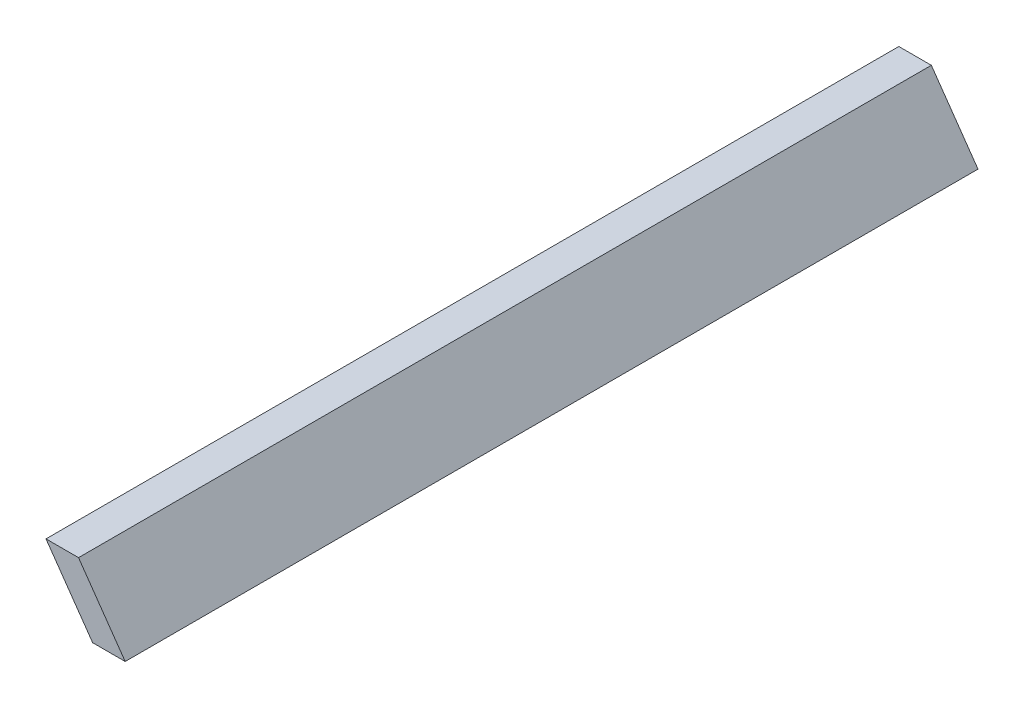
ISO-10303-21;
HEADER;
FILE_DESCRIPTION(('STEP AP214'),'2;1');
FILE_NAME('part.step','',(''),(''),'','','');
FILE_SCHEMA(('AUTOMOTIVE_DESIGN { 1 0 10303 214 1 1 1 1 }'));
ENDSEC;
DATA;
#1=APPLICATION_CONTEXT('core data for automotive mechanical design processes');
#2=APPLICATION_PROTOCOL_DEFINITION('international standard','automotive_design',2000,#1);
#3=PRODUCT_CONTEXT('',#1,'mechanical');
#4=PRODUCT('Part','Part','',(#3));
#5=PRODUCT_RELATED_PRODUCT_CATEGORY('part','',(#4));
#6=PRODUCT_DEFINITION_FORMATION('','',#4);
#7=PRODUCT_DEFINITION_CONTEXT('part definition',#1,'design');
#8=PRODUCT_DEFINITION('design','',#6,#7);
#9=PRODUCT_DEFINITION_SHAPE('','',#8);
#10=(LENGTH_UNIT() NAMED_UNIT(*) SI_UNIT(.MILLI.,.METRE.));
#11=(NAMED_UNIT(*) PLANE_ANGLE_UNIT() SI_UNIT($,.RADIAN.));
#12=(NAMED_UNIT(*) SI_UNIT($,.STERADIAN.) SOLID_ANGLE_UNIT());
#13=UNCERTAINTY_MEASURE_WITH_UNIT(LENGTH_MEASURE(1.E-05),#10,'distance_accuracy_value','');
#14=(GEOMETRIC_REPRESENTATION_CONTEXT(3) GLOBAL_UNCERTAINTY_ASSIGNED_CONTEXT((#13)) GLOBAL_UNIT_ASSIGNED_CONTEXT((#10,
#11,#12)) REPRESENTATION_CONTEXT('',''));
#15=CARTESIAN_POINT('',(0.,0.,0.));
#16=DIRECTION('',(0.,0.,1.));
#17=DIRECTION('',(1.,0.,0.));
#18=AXIS2_PLACEMENT_3D('',#15,#16,#17);
#19=CARTESIAN_POINT('',(-7.75191863863524,0.,203.2));
#20=DIRECTION('',(0.819152044288993,0.573576436351044,0.));
#21=DIRECTION('',(-0.573576436351044,0.819152044288993,0.));
#22=AXIS2_PLACEMENT_3D('',#19,#20,#21);
#23=PLANE('',#22);
#24=CARTESIAN_POINT('',(-13.3098159731748,7.9375,62.4540852674733));
#25=DIRECTION('',(0.819152044288993,0.573576436351044,0.));
#26=DIRECTION('',(-0.573576436351044,0.819152044288993,0.));
#27=AXIS2_PLACEMENT_3D('',#24,#25,#26);
#28=ELLIPSE('',#27,4.13487340184803,3.38709);
#29=CARTESIAN_POINT('',(-13.3098159731748,7.9375,65.8411752674733));
#30=VERTEX_POINT('',#29);
#31=CARTESIAN_POINT('',(-13.3098159731748,7.9375,59.0669952674733));
#32=VERTEX_POINT('',#31);
#33=EDGE_CURVE('E309',#30,#32,#28,.F.);
#34=ORIENTED_EDGE('',*,*,#33,.F.);
#35=DIRECTION('',(-0.573576436351044,0.819152044288993,0.));
#36=VECTOR('',#35,1.);
#37=CARTESIAN_POINT('',(-7.75191863863524,0.,65.8411752674733));
#38=LINE('',#37,#36);
#39=CARTESIAN_POINT('',(-11.7557133077143,5.71801137605005,65.8411752674733));
#40=VERTEX_POINT('',#39);
#41=EDGE_CURVE('E307',#40,#30,#38,.T.);
#42=ORIENTED_EDGE('',*,*,#41,.F.);
#43=DIRECTION('',(0.,0.,-1.));
#44=VECTOR('',#43,1.);
#45=CARTESIAN_POINT('',(-11.7557133077143,5.71801137605005,203.2));
#46=LINE('',#45,#44);
#47=CARTESIAN_POINT('',(-11.7557133077143,5.71801137605005,59.0669952674733));
#48=VERTEX_POINT('',#47);
#49=EDGE_CURVE('E302',#40,#48,#46,.T.);
#50=ORIENTED_EDGE('',*,*,#49,.T.);
#51=DIRECTION('',(0.573576436351044,-0.819152044288993,0.));
#52=VECTOR('',#51,1.);
#53=CARTESIAN_POINT('',(-7.75191863863548,3.43392782571507E-13,59.0669952674733));
#54=LINE('',#53,#52);
#55=EDGE_CURVE('E305',#32,#48,#54,.T.);
#56=ORIENTED_EDGE('',*,*,#55,.F.);
#57=EDGE_LOOP('',(#34,#42,#50,#56));
#58=FACE_BOUND('',#57,.T.);
#59=CARTESIAN_POINT('',(-13.3098159731748,7.93749999999998,138.654085267473));
#60=DIRECTION('',(0.819152044288993,0.573576436351044,0.));
#61=DIRECTION('',(-0.573576436351044,0.819152044288993,0.));
#62=AXIS2_PLACEMENT_3D('',#59,#60,#61);
#63=ELLIPSE('',#62,4.13487340184803,3.38709);
#64=CARTESIAN_POINT('',(-13.3098159731748,7.93749999999998,142.041175267473));
#65=VERTEX_POINT('',#64);
#66=CARTESIAN_POINT('',(-13.3098159731748,7.93749999999998,135.266995267473));
#67=VERTEX_POINT('',#66);
#68=EDGE_CURVE('E290',#65,#67,#63,.F.);
#69=ORIENTED_EDGE('',*,*,#68,.F.);
#70=DIRECTION('',(-0.573576436351044,0.819152044288993,0.));
#71=VECTOR('',#70,1.);
#72=CARTESIAN_POINT('',(-7.75191863863524,0.,142.041175267473));
#73=LINE('',#72,#71);
#74=CARTESIAN_POINT('',(-11.7557133077143,5.71801137605005,142.041175267473));
#75=VERTEX_POINT('',#74);
#76=EDGE_CURVE('E288',#75,#65,#73,.T.);
#77=ORIENTED_EDGE('',*,*,#76,.F.);
#78=DIRECTION('',(0.,0.,-1.));
#79=VECTOR('',#78,1.);
#80=CARTESIAN_POINT('',(-11.7557133077143,5.71801137605005,203.2));
#81=LINE('',#80,#79);
#82=CARTESIAN_POINT('',(-11.7557133077143,5.71801137605005,135.266995267473));
#83=VERTEX_POINT('',#82);
#84=EDGE_CURVE('E282',#75,#83,#81,.T.);
#85=ORIENTED_EDGE('',*,*,#84,.T.);
#86=DIRECTION('',(0.573576436351044,-0.819152044288993,0.));
#87=VECTOR('',#86,1.);
#88=CARTESIAN_POINT('',(-7.75191863863535,1.64599783055797E-13,135.266995267473));
#89=LINE('',#88,#87);
#90=EDGE_CURVE('E285',#67,#83,#89,.T.);
#91=ORIENTED_EDGE('',*,*,#90,.F.);
#92=EDGE_LOOP('',(#69,#77,#85,#91));
#93=FACE_BOUND('',#92,.T.);
#94=DIRECTION('',(0.573576436351044,-0.819152044288993,0.));
#95=VECTOR('',#94,1.);
#96=CARTESIAN_POINT('',(-7.75191863863524,0.,0.));
#97=LINE('',#96,#95);
#98=CARTESIAN_POINT('',(-18.8677133077143,15.875,0.));
#99=VERTEX_POINT('',#98);
#100=CARTESIAN_POINT('',(-7.75191863863524,0.,0.));
#101=VERTEX_POINT('',#100);
#102=EDGE_CURVE('E258',#99,#101,#97,.T.);
#103=ORIENTED_EDGE('',*,*,#102,.T.);
#104=DIRECTION('',(0.,0.,-1.));
#105=VECTOR('',#104,1.);
#106=CARTESIAN_POINT('',(-7.75191863863524,0.,203.2));
#107=LINE('',#106,#105);
#108=CARTESIAN_POINT('',(-7.75191863863524,0.,203.2));
#109=VERTEX_POINT('',#108);
#110=EDGE_CURVE('E263',#109,#101,#107,.T.);
#111=ORIENTED_EDGE('',*,*,#110,.F.);
#112=DIRECTION('',(0.573576436351044,-0.819152044288993,0.));
#113=VECTOR('',#112,1.);
#114=CARTESIAN_POINT('',(-7.75191863863524,0.,203.2));
#115=LINE('',#114,#113);
#116=CARTESIAN_POINT('',(-18.8677133077143,15.875,203.2));
#117=VERTEX_POINT('',#116);
#118=EDGE_CURVE('E249',#117,#109,#115,.T.);
#119=ORIENTED_EDGE('',*,*,#118,.F.);
#120=DIRECTION('',(0.,0.,-1.));
#121=VECTOR('',#120,1.);
#122=CARTESIAN_POINT('',(-18.8677133077143,15.875,203.2));
#123=LINE('',#122,#121);
#124=EDGE_CURVE('E266',#117,#99,#123,.T.);
#125=ORIENTED_EDGE('',*,*,#124,.T.);
#126=EDGE_LOOP('',(#103,#111,#119,#125));
#127=FACE_BOUND('',#126,.T.);
#128=CARTESIAN_POINT('',(-13.3098159731748,7.93749999999997,176.754085267473));
#129=DIRECTION('',(0.819152044288993,0.573576436351044,0.));
#130=DIRECTION('',(-0.573576436351044,0.819152044288993,0.));
#131=AXIS2_PLACEMENT_3D('',#128,#129,#130);
#132=ELLIPSE('',#131,4.13487340184803,3.38709);
#133=CARTESIAN_POINT('',(-13.3098159731748,7.93749999999998,180.141175267473));
#134=VERTEX_POINT('',#133);
#135=CARTESIAN_POINT('',(-13.3098159731748,7.93749999999998,173.366995267473));
#136=VERTEX_POINT('',#135);
#137=EDGE_CURVE('E280',#134,#136,#132,.F.);
#138=ORIENTED_EDGE('',*,*,#137,.F.);
#139=DIRECTION('',(-0.573576436351044,0.819152044288993,0.));
#140=VECTOR('',#139,1.);
#141=CARTESIAN_POINT('',(-7.75191863863524,0.,180.141175267473));
#142=LINE('',#141,#140);
#143=CARTESIAN_POINT('',(-11.7557133077143,5.71801137605005,180.141175267473));
#144=VERTEX_POINT('',#143);
#145=EDGE_CURVE('E278',#144,#134,#142,.T.);
#146=ORIENTED_EDGE('',*,*,#145,.F.);
#147=DIRECTION('',(0.,0.,-1.));
#148=VECTOR('',#147,1.);
#149=CARTESIAN_POINT('',(-11.7557133077143,5.71801137605005,203.2));
#150=LINE('',#149,#148);
#151=CARTESIAN_POINT('',(-11.7557133077143,5.71801137605005,173.366995267473));
#152=VERTEX_POINT('',#151);
#153=EDGE_CURVE('E272',#144,#152,#150,.T.);
#154=ORIENTED_EDGE('',*,*,#153,.T.);
#155=DIRECTION('',(0.573576436351044,-0.819152044288993,0.));
#156=VECTOR('',#155,1.);
#157=CARTESIAN_POINT('',(-7.75191863863529,0.,173.366995267473));
#158=LINE('',#157,#156);
#159=EDGE_CURVE('E275',#136,#152,#158,.T.);
#160=ORIENTED_EDGE('',*,*,#159,.F.);
#161=EDGE_LOOP('',(#138,#146,#154,#160));
#162=FACE_BOUND('',#161,.T.);
#163=CARTESIAN_POINT('',(-13.3098159731748,7.93749999999999,100.554085267473));
#164=DIRECTION('',(0.819152044288993,0.573576436351044,0.));
#165=DIRECTION('',(-0.573576436351044,0.819152044288993,0.));
#166=AXIS2_PLACEMENT_3D('',#163,#164,#165);
#167=ELLIPSE('',#166,4.13487340184803,3.38709);
#168=CARTESIAN_POINT('',(-13.3098159731748,7.93749999999999,103.941175267473));
#169=VERTEX_POINT('',#168);
#170=CARTESIAN_POINT('',(-13.3098159731748,7.93749999999999,97.1669952674733));
#171=VERTEX_POINT('',#170);
#172=EDGE_CURVE('E300',#169,#171,#167,.F.);
#173=ORIENTED_EDGE('',*,*,#172,.F.);
#174=DIRECTION('',(-0.573576436351044,0.819152044288993,0.));
#175=VECTOR('',#174,1.);
#176=CARTESIAN_POINT('',(-7.75191863863524,0.,103.941175267473));
#177=LINE('',#176,#175);
#178=CARTESIAN_POINT('',(-11.7557133077143,5.71801137605005,103.941175267473));
#179=VERTEX_POINT('',#178);
#180=EDGE_CURVE('E298',#179,#169,#177,.T.);
#181=ORIENTED_EDGE('',*,*,#180,.F.);
#182=DIRECTION('',(0.,0.,-1.));
#183=VECTOR('',#182,1.);
#184=CARTESIAN_POINT('',(-11.7557133077143,5.71801137605005,203.2));
#185=LINE('',#184,#183);
#186=CARTESIAN_POINT('',(-11.7557133077143,5.71801137605005,97.1669952674733));
#187=VERTEX_POINT('',#186);
#188=EDGE_CURVE('E292',#179,#187,#185,.T.);
#189=ORIENTED_EDGE('',*,*,#188,.T.);
#190=DIRECTION('',(0.573576436351044,-0.819152044288993,0.));
#191=VECTOR('',#190,1.);
#192=CARTESIAN_POINT('',(-7.75191863863541,2.53996282813652E-13,97.1669952674733));
#193=LINE('',#192,#191);
#194=EDGE_CURVE('E295',#171,#187,#193,.T.);
#195=ORIENTED_EDGE('',*,*,#194,.F.);
#196=EDGE_LOOP('',(#173,#181,#189,#195));
#197=FACE_BOUND('',#196,.T.);
#198=CARTESIAN_POINT('',(-13.3098159731748,7.93750000000001,24.3540852674733));
#199=DIRECTION('',(0.819152044288993,0.573576436351044,0.));
#200=DIRECTION('',(-0.573576436351044,0.819152044288993,0.));
#201=AXIS2_PLACEMENT_3D('',#198,#199,#200);
#202=ELLIPSE('',#201,4.13487340184803,3.38709);
#203=CARTESIAN_POINT('',(-13.3098159731748,7.93750000000001,27.7411752674733));
#204=VERTEX_POINT('',#203);
#205=CARTESIAN_POINT('',(-13.3098159731748,7.93750000000001,20.9669952674733));
#206=VERTEX_POINT('',#205);
#207=EDGE_CURVE('E11',#204,#206,#202,.F.);
#208=ORIENTED_EDGE('',*,*,#207,.F.);
#209=DIRECTION('',(-0.573576436351044,0.819152044288993,0.));
#210=VECTOR('',#209,1.);
#211=CARTESIAN_POINT('',(-7.75191863863524,0.,27.7411752674733));
#212=LINE('',#211,#210);
#213=CARTESIAN_POINT('',(-11.7557133077143,5.71801137605005,27.7411752674733));
#214=VERTEX_POINT('',#213);
#215=EDGE_CURVE('E43',#214,#204,#212,.T.);
#216=ORIENTED_EDGE('',*,*,#215,.F.);
#217=DIRECTION('',(0.,0.,-1.));
#218=VECTOR('',#217,1.);
#219=CARTESIAN_POINT('',(-11.7557133077143,5.71801137605005,203.2));
#220=LINE('',#219,#218);
#221=CARTESIAN_POINT('',(-11.7557133077143,5.71801137605005,20.9669952674733));
#222=VERTEX_POINT('',#221);
#223=EDGE_CURVE('E168',#214,#222,#220,.T.);
#224=ORIENTED_EDGE('',*,*,#223,.T.);
#225=DIRECTION('',(0.573576436351044,-0.819152044288993,0.));
#226=VECTOR('',#225,1.);
#227=CARTESIAN_POINT('',(-7.75191863863554,4.32789282329362E-13,20.9669952674733));
#228=LINE('',#227,#226);
#229=EDGE_CURVE('E312',#206,#222,#228,.T.);
#230=ORIENTED_EDGE('',*,*,#229,.F.);
#231=EDGE_LOOP('',(#208,#216,#224,#230));
#232=FACE_BOUND('',#231,.T.);
#233=ADVANCED_FACE('F35',(#58,#93,#127,#162,#197,#232),#23,.F.);
#234=CARTESIAN_POINT('',(-11.1157946690791,15.875,203.2));
#235=DIRECTION('',(-0.819152044288993,-0.573576436351044,0.));
#236=DIRECTION('',(0.573576436351044,-0.819152044288993,0.));
#237=AXIS2_PLACEMENT_3D('',#234,#235,#236);
#238=PLANE('',#237);
#239=DIRECTION('',(-0.573576436351044,0.819152044288993,0.));
#240=VECTOR('',#239,1.);
#241=CARTESIAN_POINT('',(-11.1157946690791,15.875,0.));
#242=LINE('',#241,#240);
#243=CARTESIAN_POINT('',(0.,0.,0.));
#244=VERTEX_POINT('',#243);
#245=CARTESIAN_POINT('',(-11.1157946690791,15.875,0.));
#246=VERTEX_POINT('',#245);
#247=EDGE_CURVE('E242',#244,#246,#242,.T.);
#248=ORIENTED_EDGE('',*,*,#247,.T.);
#249=DIRECTION('',(0.,0.,-1.));
#250=VECTOR('',#249,1.);
#251=CARTESIAN_POINT('',(-11.1157946690791,15.875,203.2));
#252=LINE('',#251,#250);
#253=CARTESIAN_POINT('',(-11.1157946690791,15.875,203.2));
#254=VERTEX_POINT('',#253);
#255=EDGE_CURVE('E269',#254,#246,#252,.T.);
#256=ORIENTED_EDGE('',*,*,#255,.F.);
#257=DIRECTION('',(-0.573576436351044,0.819152044288993,0.));
#258=VECTOR('',#257,1.);
#259=CARTESIAN_POINT('',(-11.1157946690791,15.875,203.2));
#260=LINE('',#259,#258);
#261=CARTESIAN_POINT('',(0.,0.,203.2));
#262=VERTEX_POINT('',#261);
#263=EDGE_CURVE('E243',#262,#254,#260,.T.);
#264=ORIENTED_EDGE('',*,*,#263,.F.);
#265=DIRECTION('',(0.,0.,-1.));
#266=VECTOR('',#265,1.);
#267=CARTESIAN_POINT('',(0.,0.,203.2));
#268=LINE('',#267,#266);
#269=EDGE_CURVE('E253',#262,#244,#268,.T.);
#270=ORIENTED_EDGE('',*,*,#269,.T.);
#271=EDGE_LOOP('',(#248,#256,#264,#270));
#272=FACE_BOUND('',#271,.T.);
#273=ADVANCED_FACE('F37',(#272),#238,.F.);
#274=CARTESIAN_POINT('',(-18.8677133077143,15.875,203.2));
#275=DIRECTION('',(0.,-1.,0.));
#276=DIRECTION('',(1.,0.,0.));
#277=AXIS2_PLACEMENT_3D('',#274,#275,#276);
#278=PLANE('',#277);
#279=DIRECTION('',(-1.,0.,0.));
#280=VECTOR('',#279,1.);
#281=CARTESIAN_POINT('',(-18.8677133077143,15.875,0.));
#282=LINE('',#281,#280);
#283=EDGE_CURVE('E256',#246,#99,#282,.T.);
#284=ORIENTED_EDGE('',*,*,#283,.T.);
#285=ORIENTED_EDGE('',*,*,#124,.F.);
#286=DIRECTION('',(-1.,0.,0.));
#287=VECTOR('',#286,1.);
#288=CARTESIAN_POINT('',(-18.8677133077143,15.875,203.2));
#289=LINE('',#288,#287);
#290=EDGE_CURVE('E246',#254,#117,#289,.T.);
#291=ORIENTED_EDGE('',*,*,#290,.F.);
#292=ORIENTED_EDGE('',*,*,#255,.T.);
#293=EDGE_LOOP('',(#284,#285,#291,#292));
#294=FACE_BOUND('',#293,.T.);
#295=ADVANCED_FACE('F323',(#294),#278,.F.);
#296=CARTESIAN_POINT('',(0.,0.,203.2));
#297=DIRECTION('',(0.,1.,0.));
#298=DIRECTION('',(-1.,0.,0.));
#299=AXIS2_PLACEMENT_3D('',#296,#297,#298);
#300=PLANE('',#299);
#301=DIRECTION('',(1.,0.,0.));
#302=VECTOR('',#301,1.);
#303=CARTESIAN_POINT('',(0.,0.,0.));
#304=LINE('',#303,#302);
#305=EDGE_CURVE('E247',#101,#244,#304,.T.);
#306=ORIENTED_EDGE('',*,*,#305,.T.);
#307=ORIENTED_EDGE('',*,*,#269,.F.);
#308=DIRECTION('',(1.,0.,0.));
#309=VECTOR('',#308,1.);
#310=CARTESIAN_POINT('',(0.,0.,203.2));
#311=LINE('',#310,#309);
#312=EDGE_CURVE('E251',#109,#262,#311,.T.);
#313=ORIENTED_EDGE('',*,*,#312,.F.);
#314=ORIENTED_EDGE('',*,*,#110,.T.);
#315=EDGE_LOOP('',(#306,#307,#313,#314));
#316=FACE_BOUND('',#315,.T.);
#317=ADVANCED_FACE('F328',(#316),#300,.F.);
#318=CARTESIAN_POINT('',(0.,0.,203.2));
#319=DIRECTION('',(0.,0.,-1.));
#320=DIRECTION('',(-1.,0.,0.));
#321=AXIS2_PLACEMENT_3D('',#318,#319,#320);
#322=PLANE('',#321);
#323=ORIENTED_EDGE('',*,*,#263,.T.);
#324=ORIENTED_EDGE('',*,*,#290,.T.);
#325=ORIENTED_EDGE('',*,*,#118,.T.);
#326=ORIENTED_EDGE('',*,*,#312,.T.);
#327=EDGE_LOOP('',(#323,#324,#325,#326));
#328=FACE_BOUND('',#327,.T.);
#329=ADVANCED_FACE('F335',(#328),#322,.F.);
#330=CARTESIAN_POINT('',(0.,0.,0.));
#331=DIRECTION('',(0.,0.,-1.));
#332=DIRECTION('',(-1.,0.,0.));
#333=AXIS2_PLACEMENT_3D('',#330,#331,#332);
#334=PLANE('',#333);
#335=ORIENTED_EDGE('',*,*,#247,.F.);
#336=ORIENTED_EDGE('',*,*,#305,.F.);
#337=ORIENTED_EDGE('',*,*,#102,.F.);
#338=ORIENTED_EDGE('',*,*,#283,.F.);
#339=EDGE_LOOP('',(#335,#336,#337,#338));
#340=FACE_BOUND('',#339,.T.);
#341=ADVANCED_FACE('F347',(#340),#334,.T.);
#342=CARTESIAN_POINT('',(-11.7557133077143,7.93749999999997,176.754085267473));
#343=DIRECTION('',(-1.,0.,0.));
#344=DIRECTION('',(0.,0.,1.));
#345=AXIS2_PLACEMENT_3D('',#342,#343,#344);
#346=CYLINDRICAL_SURFACE('',#345,3.38709);
#347=ORIENTED_EDGE('',*,*,#137,.T.);
#348=DIRECTION('',(-1.,0.,0.));
#349=VECTOR('',#348,1.);
#350=CARTESIAN_POINT('',(-11.7557133077143,7.93749999999997,173.366995267473));
#351=LINE('',#350,#349);
#352=CARTESIAN_POINT('',(-11.7557133077143,7.93749999999997,173.366995267473));
#353=VERTEX_POINT('',#352);
#354=EDGE_CURVE('E236',#353,#136,#351,.T.);
#355=ORIENTED_EDGE('',*,*,#354,.F.);
#356=CARTESIAN_POINT('',(-11.7557133077143,7.93749999999997,176.754085267473));
#357=DIRECTION('',(1.,0.,0.));
#358=DIRECTION('',(0.,0.,-1.));
#359=AXIS2_PLACEMENT_3D('',#356,#357,#358);
#360=CIRCLE('',#359,3.38709);
#361=CARTESIAN_POINT('',(-11.7557133077143,7.93749999999997,180.141175267473));
#362=VERTEX_POINT('',#361);
#363=EDGE_CURVE('E228',#353,#362,#360,.T.);
#364=ORIENTED_EDGE('',*,*,#363,.T.);
#365=DIRECTION('',(-1.,0.,0.));
#366=VECTOR('',#365,1.);
#367=CARTESIAN_POINT('',(-11.7557133077143,7.93749999999997,180.141175267473));
#368=LINE('',#367,#366);
#369=EDGE_CURVE('E239',#362,#134,#368,.T.);
#370=ORIENTED_EDGE('',*,*,#369,.T.);
#371=EDGE_LOOP('',(#347,#355,#364,#370));
#372=FACE_BOUND('',#371,.T.);
#373=ADVANCED_FACE('F357',(#372),#346,.F.);
#374=CARTESIAN_POINT('',(-11.7557133077143,7.93749999999997,180.141175267473));
#375=DIRECTION('',(0.,0.,-1.));
#376=DIRECTION('',(-1.,0.,0.));
#377=AXIS2_PLACEMENT_3D('',#374,#375,#376);
#378=PLANE('',#377);
#379=ORIENTED_EDGE('',*,*,#145,.T.);
#380=ORIENTED_EDGE('',*,*,#369,.F.);
#381=DIRECTION('',(0.,-1.,0.));
#382=VECTOR('',#381,1.);
#383=CARTESIAN_POINT('',(-11.7557133077143,7.93749999999997,180.141175267473));
#384=LINE('',#383,#382);
#385=EDGE_CURVE('E231',#362,#144,#384,.T.);
#386=ORIENTED_EDGE('',*,*,#385,.T.);
#387=EDGE_LOOP('',(#379,#380,#386));
#388=FACE_BOUND('',#387,.T.);
#389=ADVANCED_FACE('F361',(#388),#378,.T.);
#390=CARTESIAN_POINT('',(-11.7557133077143,0.,173.366995267473));
#391=DIRECTION('',(0.,0.,1.));
#392=DIRECTION('',(0.,-1.,0.));
#393=AXIS2_PLACEMENT_3D('',#390,#391,#392);
#394=PLANE('',#393);
#395=ORIENTED_EDGE('',*,*,#159,.T.);
#396=DIRECTION('',(0.,1.,0.));
#397=VECTOR('',#396,1.);
#398=CARTESIAN_POINT('',(-11.7557133077143,0.,173.366995267473));
#399=LINE('',#398,#397);
#400=EDGE_CURVE('E234',#152,#353,#399,.T.);
#401=ORIENTED_EDGE('',*,*,#400,.T.);
#402=ORIENTED_EDGE('',*,*,#354,.T.);
#403=EDGE_LOOP('',(#395,#401,#402));
#404=FACE_BOUND('',#403,.T.);
#405=ADVANCED_FACE('F365',(#404),#394,.T.);
#406=CARTESIAN_POINT('',(-11.7557133077143,7.93749999999997,176.754085267473));
#407=DIRECTION('',(1.,0.,0.));
#408=DIRECTION('',(0.,0.,-1.));
#409=AXIS2_PLACEMENT_3D('',#406,#407,#408);
#410=PLANE('',#409);
#411=ORIENTED_EDGE('',*,*,#385,.F.);
#412=ORIENTED_EDGE('',*,*,#363,.F.);
#413=ORIENTED_EDGE('',*,*,#400,.F.);
#414=ORIENTED_EDGE('',*,*,#153,.F.);
#415=EDGE_LOOP('',(#411,#412,#413,#414));
#416=FACE_BOUND('',#415,.T.);
#417=ADVANCED_FACE('F369',(#416),#410,.F.);
#418=CARTESIAN_POINT('',(-11.7557133077143,7.93749999999998,138.654085267473));
#419=DIRECTION('',(-1.,0.,0.));
#420=DIRECTION('',(0.,0.,1.));
#421=AXIS2_PLACEMENT_3D('',#418,#419,#420);
#422=CYLINDRICAL_SURFACE('',#421,3.38709);
#423=ORIENTED_EDGE('',*,*,#68,.T.);
#424=DIRECTION('',(-1.,0.,0.));
#425=VECTOR('',#424,1.);
#426=CARTESIAN_POINT('',(-11.7557133077143,7.93749999999998,135.266995267473));
#427=LINE('',#426,#425);
#428=CARTESIAN_POINT('',(-11.7557133077143,7.93749999999998,135.266995267473));
#429=VERTEX_POINT('',#428);
#430=EDGE_CURVE('E222',#429,#67,#427,.T.);
#431=ORIENTED_EDGE('',*,*,#430,.F.);
#432=CARTESIAN_POINT('',(-11.7557133077143,7.93749999999998,138.654085267473));
#433=DIRECTION('',(1.,0.,0.));
#434=DIRECTION('',(0.,0.,-1.));
#435=AXIS2_PLACEMENT_3D('',#432,#433,#434);
#436=CIRCLE('',#435,3.38709);
#437=CARTESIAN_POINT('',(-11.7557133077143,7.93749999999998,142.041175267473));
#438=VERTEX_POINT('',#437);
#439=EDGE_CURVE('E214',#429,#438,#436,.T.);
#440=ORIENTED_EDGE('',*,*,#439,.T.);
#441=DIRECTION('',(-1.,0.,0.));
#442=VECTOR('',#441,1.);
#443=CARTESIAN_POINT('',(-11.7557133077143,7.93749999999998,142.041175267473));
#444=LINE('',#443,#442);
#445=EDGE_CURVE('E225',#438,#65,#444,.T.);
#446=ORIENTED_EDGE('',*,*,#445,.T.);
#447=EDGE_LOOP('',(#423,#431,#440,#446));
#448=FACE_BOUND('',#447,.T.);
#449=ADVANCED_FACE('F373',(#448),#422,.F.);
#450=CARTESIAN_POINT('',(-11.7557133077143,7.93749999999998,142.041175267473));
#451=DIRECTION('',(0.,0.,-1.));
#452=DIRECTION('',(-1.,0.,0.));
#453=AXIS2_PLACEMENT_3D('',#450,#451,#452);
#454=PLANE('',#453);
#455=ORIENTED_EDGE('',*,*,#76,.T.);
#456=ORIENTED_EDGE('',*,*,#445,.F.);
#457=DIRECTION('',(0.,-1.,0.));
#458=VECTOR('',#457,1.);
#459=CARTESIAN_POINT('',(-11.7557133077143,7.93749999999998,142.041175267473));
#460=LINE('',#459,#458);
#461=EDGE_CURVE('E217',#438,#75,#460,.T.);
#462=ORIENTED_EDGE('',*,*,#461,.T.);
#463=EDGE_LOOP('',(#455,#456,#462));
#464=FACE_BOUND('',#463,.T.);
#465=ADVANCED_FACE('F377',(#464),#454,.T.);
#466=CARTESIAN_POINT('',(-11.7557133077143,0.,135.266995267473));
#467=DIRECTION('',(0.,0.,1.));
#468=DIRECTION('',(0.,-1.,0.));
#469=AXIS2_PLACEMENT_3D('',#466,#467,#468);
#470=PLANE('',#469);
#471=ORIENTED_EDGE('',*,*,#90,.T.);
#472=DIRECTION('',(0.,1.,0.));
#473=VECTOR('',#472,1.);
#474=CARTESIAN_POINT('',(-11.7557133077143,0.,135.266995267473));
#475=LINE('',#474,#473);
#476=EDGE_CURVE('E220',#83,#429,#475,.T.);
#477=ORIENTED_EDGE('',*,*,#476,.T.);
#478=ORIENTED_EDGE('',*,*,#430,.T.);
#479=EDGE_LOOP('',(#471,#477,#478));
#480=FACE_BOUND('',#479,.T.);
#481=ADVANCED_FACE('F381',(#480),#470,.T.);
#482=CARTESIAN_POINT('',(-11.7557133077143,7.93749999999998,138.654085267473));
#483=DIRECTION('',(1.,0.,0.));
#484=DIRECTION('',(0.,0.,-1.));
#485=AXIS2_PLACEMENT_3D('',#482,#483,#484);
#486=PLANE('',#485);
#487=ORIENTED_EDGE('',*,*,#461,.F.);
#488=ORIENTED_EDGE('',*,*,#439,.F.);
#489=ORIENTED_EDGE('',*,*,#476,.F.);
#490=ORIENTED_EDGE('',*,*,#84,.F.);
#491=EDGE_LOOP('',(#487,#488,#489,#490));
#492=FACE_BOUND('',#491,.T.);
#493=ADVANCED_FACE('F385',(#492),#486,.F.);
#494=CARTESIAN_POINT('',(-11.7557133077143,7.93749999999999,100.554085267473));
#495=DIRECTION('',(-1.,0.,0.));
#496=DIRECTION('',(0.,0.,1.));
#497=AXIS2_PLACEMENT_3D('',#494,#495,#496);
#498=CYLINDRICAL_SURFACE('',#497,3.38709);
#499=ORIENTED_EDGE('',*,*,#172,.T.);
#500=DIRECTION('',(-1.,0.,0.));
#501=VECTOR('',#500,1.);
#502=CARTESIAN_POINT('',(-11.7557133077143,7.93749999999999,97.1669952674733));
#503=LINE('',#502,#501);
#504=CARTESIAN_POINT('',(-11.7557133077143,7.93749999999999,97.1669952674733));
#505=VERTEX_POINT('',#504);
#506=EDGE_CURVE('E208',#505,#171,#503,.T.);
#507=ORIENTED_EDGE('',*,*,#506,.F.);
#508=CARTESIAN_POINT('',(-11.7557133077143,7.93749999999999,100.554085267473));
#509=DIRECTION('',(1.,0.,0.));
#510=DIRECTION('',(0.,0.,-1.));
#511=AXIS2_PLACEMENT_3D('',#508,#509,#510);
#512=CIRCLE('',#511,3.38709);
#513=CARTESIAN_POINT('',(-11.7557133077143,7.93749999999999,103.941175267473));
#514=VERTEX_POINT('',#513);
#515=EDGE_CURVE('E200',#505,#514,#512,.T.);
#516=ORIENTED_EDGE('',*,*,#515,.T.);
#517=DIRECTION('',(-1.,0.,0.));
#518=VECTOR('',#517,1.);
#519=CARTESIAN_POINT('',(-11.7557133077143,7.93749999999999,103.941175267473));
#520=LINE('',#519,#518);
#521=EDGE_CURVE('E211',#514,#169,#520,.T.);
#522=ORIENTED_EDGE('',*,*,#521,.T.);
#523=EDGE_LOOP('',(#499,#507,#516,#522));
#524=FACE_BOUND('',#523,.T.);
#525=ADVANCED_FACE('F389',(#524),#498,.F.);
#526=CARTESIAN_POINT('',(-11.7557133077143,7.93749999999999,103.941175267473));
#527=DIRECTION('',(0.,0.,-1.));
#528=DIRECTION('',(-1.,0.,0.));
#529=AXIS2_PLACEMENT_3D('',#526,#527,#528);
#530=PLANE('',#529);
#531=ORIENTED_EDGE('',*,*,#180,.T.);
#532=ORIENTED_EDGE('',*,*,#521,.F.);
#533=DIRECTION('',(0.,-1.,0.));
#534=VECTOR('',#533,1.);
#535=CARTESIAN_POINT('',(-11.7557133077143,7.93749999999999,103.941175267473));
#536=LINE('',#535,#534);
#537=EDGE_CURVE('E203',#514,#179,#536,.T.);
#538=ORIENTED_EDGE('',*,*,#537,.T.);
#539=EDGE_LOOP('',(#531,#532,#538));
#540=FACE_BOUND('',#539,.T.);
#541=ADVANCED_FACE('F393',(#540),#530,.T.);
#542=CARTESIAN_POINT('',(-11.7557133077143,0.,97.1669952674733));
#543=DIRECTION('',(0.,0.,1.));
#544=DIRECTION('',(0.,-1.,0.));
#545=AXIS2_PLACEMENT_3D('',#542,#543,#544);
#546=PLANE('',#545);
#547=ORIENTED_EDGE('',*,*,#194,.T.);
#548=DIRECTION('',(0.,1.,0.));
#549=VECTOR('',#548,1.);
#550=CARTESIAN_POINT('',(-11.7557133077143,0.,97.1669952674733));
#551=LINE('',#550,#549);
#552=EDGE_CURVE('E206',#187,#505,#551,.T.);
#553=ORIENTED_EDGE('',*,*,#552,.T.);
#554=ORIENTED_EDGE('',*,*,#506,.T.);
#555=EDGE_LOOP('',(#547,#553,#554));
#556=FACE_BOUND('',#555,.T.);
#557=ADVANCED_FACE('F397',(#556),#546,.T.);
#558=CARTESIAN_POINT('',(-11.7557133077143,7.93749999999999,100.554085267473));
#559=DIRECTION('',(1.,0.,0.));
#560=DIRECTION('',(0.,0.,-1.));
#561=AXIS2_PLACEMENT_3D('',#558,#559,#560);
#562=PLANE('',#561);
#563=ORIENTED_EDGE('',*,*,#537,.F.);
#564=ORIENTED_EDGE('',*,*,#515,.F.);
#565=ORIENTED_EDGE('',*,*,#552,.F.);
#566=ORIENTED_EDGE('',*,*,#188,.F.);
#567=EDGE_LOOP('',(#563,#564,#565,#566));
#568=FACE_BOUND('',#567,.T.);
#569=ADVANCED_FACE('F401',(#568),#562,.F.);
#570=CARTESIAN_POINT('',(-11.7557133077143,7.9375,62.4540852674733));
#571=DIRECTION('',(-1.,0.,0.));
#572=DIRECTION('',(0.,0.,1.));
#573=AXIS2_PLACEMENT_3D('',#570,#571,#572);
#574=CYLINDRICAL_SURFACE('',#573,3.38709);
#575=ORIENTED_EDGE('',*,*,#33,.T.);
#576=DIRECTION('',(-1.,0.,0.));
#577=VECTOR('',#576,1.);
#578=CARTESIAN_POINT('',(-11.7557133077143,7.9375,59.0669952674733));
#579=LINE('',#578,#577);
#580=CARTESIAN_POINT('',(-11.7557133077143,7.9375,59.0669952674733));
#581=VERTEX_POINT('',#580);
#582=EDGE_CURVE('E194',#581,#32,#579,.T.);
#583=ORIENTED_EDGE('',*,*,#582,.F.);
#584=CARTESIAN_POINT('',(-11.7557133077143,7.9375,62.4540852674733));
#585=DIRECTION('',(1.,0.,0.));
#586=DIRECTION('',(0.,0.,-1.));
#587=AXIS2_PLACEMENT_3D('',#584,#585,#586);
#588=CIRCLE('',#587,3.38709);
#589=CARTESIAN_POINT('',(-11.7557133077143,7.9375,65.8411752674733));
#590=VERTEX_POINT('',#589);
#591=EDGE_CURVE('E183',#581,#590,#588,.T.);
#592=ORIENTED_EDGE('',*,*,#591,.T.);
#593=DIRECTION('',(-1.,0.,0.));
#594=VECTOR('',#593,1.);
#595=CARTESIAN_POINT('',(-11.7557133077143,7.9375,65.8411752674733));
#596=LINE('',#595,#594);
#597=EDGE_CURVE('E197',#590,#30,#596,.T.);
#598=ORIENTED_EDGE('',*,*,#597,.T.);
#599=EDGE_LOOP('',(#575,#583,#592,#598));
#600=FACE_BOUND('',#599,.T.);
#601=ADVANCED_FACE('F405',(#600),#574,.F.);
#602=CARTESIAN_POINT('',(-11.7557133077143,7.9375,65.8411752674733));
#603=DIRECTION('',(0.,0.,-1.));
#604=DIRECTION('',(-1.,0.,0.));
#605=AXIS2_PLACEMENT_3D('',#602,#603,#604);
#606=PLANE('',#605);
#607=ORIENTED_EDGE('',*,*,#41,.T.);
#608=ORIENTED_EDGE('',*,*,#597,.F.);
#609=DIRECTION('',(0.,-1.,0.));
#610=VECTOR('',#609,1.);
#611=CARTESIAN_POINT('',(-11.7557133077143,7.9375,65.8411752674733));
#612=LINE('',#611,#610);
#613=EDGE_CURVE('E186',#590,#40,#612,.T.);
#614=ORIENTED_EDGE('',*,*,#613,.T.);
#615=EDGE_LOOP('',(#607,#608,#614));
#616=FACE_BOUND('',#615,.T.);
#617=ADVANCED_FACE('F409',(#616),#606,.T.);
#618=CARTESIAN_POINT('',(-11.7557133077143,0.,59.0669952674733));
#619=DIRECTION('',(0.,0.,1.));
#620=DIRECTION('',(0.,-1.,0.));
#621=AXIS2_PLACEMENT_3D('',#618,#619,#620);
#622=PLANE('',#621);
#623=ORIENTED_EDGE('',*,*,#55,.T.);
#624=DIRECTION('',(0.,1.,0.));
#625=VECTOR('',#624,1.);
#626=CARTESIAN_POINT('',(-11.7557133077143,0.,59.0669952674733));
#627=LINE('',#626,#625);
#628=EDGE_CURVE('E58',#48,#581,#627,.T.);
#629=ORIENTED_EDGE('',*,*,#628,.T.);
#630=ORIENTED_EDGE('',*,*,#582,.T.);
#631=EDGE_LOOP('',(#623,#629,#630));
#632=FACE_BOUND('',#631,.T.);
#633=ADVANCED_FACE('F413',(#632),#622,.T.);
#634=CARTESIAN_POINT('',(-11.7557133077143,7.9375,62.4540852674733));
#635=DIRECTION('',(1.,0.,0.));
#636=DIRECTION('',(0.,0.,-1.));
#637=AXIS2_PLACEMENT_3D('',#634,#635,#636);
#638=PLANE('',#637);
#639=ORIENTED_EDGE('',*,*,#613,.F.);
#640=ORIENTED_EDGE('',*,*,#591,.F.);
#641=ORIENTED_EDGE('',*,*,#628,.F.);
#642=ORIENTED_EDGE('',*,*,#49,.F.);
#643=EDGE_LOOP('',(#639,#640,#641,#642));
#644=FACE_BOUND('',#643,.T.);
#645=ADVANCED_FACE('F417',(#644),#638,.F.);
#646=CARTESIAN_POINT('',(-11.7557133077143,7.93750000000001,24.3540852674733));
#647=DIRECTION('',(-1.,0.,0.));
#648=DIRECTION('',(0.,0.,1.));
#649=AXIS2_PLACEMENT_3D('',#646,#647,#648);
#650=CYLINDRICAL_SURFACE('',#649,3.38709);
#651=ORIENTED_EDGE('',*,*,#207,.T.);
#652=DIRECTION('',(-1.,0.,0.));
#653=VECTOR('',#652,1.);
#654=CARTESIAN_POINT('',(-11.7557133077143,7.93750000000001,20.9669952674733));
#655=LINE('',#654,#653);
#656=CARTESIAN_POINT('',(-11.7557133077143,7.93750000000001,20.9669952674733));
#657=VERTEX_POINT('',#656);
#658=EDGE_CURVE('E180',#657,#206,#655,.T.);
#659=ORIENTED_EDGE('',*,*,#658,.F.);
#660=CARTESIAN_POINT('',(-11.7557133077143,7.93750000000001,24.3540852674733));
#661=DIRECTION('',(1.,0.,0.));
#662=DIRECTION('',(0.,0.,-1.));
#663=AXIS2_PLACEMENT_3D('',#660,#661,#662);
#664=CIRCLE('',#663,3.38709);
#665=CARTESIAN_POINT('',(-11.7557133077143,7.93750000000001,27.7411752674733));
#666=VERTEX_POINT('',#665);
#667=EDGE_CURVE('E166',#657,#666,#664,.T.);
#668=ORIENTED_EDGE('',*,*,#667,.T.);
#669=DIRECTION('',(-1.,0.,0.));
#670=VECTOR('',#669,1.);
#671=CARTESIAN_POINT('',(-11.7557133077143,7.93750000000001,27.7411752674733));
#672=LINE('',#671,#670);
#673=EDGE_CURVE('E177',#666,#204,#672,.T.);
#674=ORIENTED_EDGE('',*,*,#673,.T.);
#675=EDGE_LOOP('',(#651,#659,#668,#674));
#676=FACE_BOUND('',#675,.T.);
#677=ADVANCED_FACE('F176',(#676),#650,.F.);
#678=CARTESIAN_POINT('',(-11.7557133077143,7.93750000000001,27.7411752674733));
#679=DIRECTION('',(0.,0.,-1.));
#680=DIRECTION('',(-1.,0.,0.));
#681=AXIS2_PLACEMENT_3D('',#678,#679,#680);
#682=PLANE('',#681);
#683=ORIENTED_EDGE('',*,*,#215,.T.);
#684=ORIENTED_EDGE('',*,*,#673,.F.);
#685=DIRECTION('',(0.,-1.,0.));
#686=VECTOR('',#685,1.);
#687=CARTESIAN_POINT('',(-11.7557133077143,7.93750000000001,27.7411752674733));
#688=LINE('',#687,#686);
#689=EDGE_CURVE('E163',#666,#214,#688,.T.);
#690=ORIENTED_EDGE('',*,*,#689,.T.);
#691=EDGE_LOOP('',(#683,#684,#690));
#692=FACE_BOUND('',#691,.T.);
#693=ADVANCED_FACE('F182',(#692),#682,.T.);
#694=CARTESIAN_POINT('',(-11.7557133077143,0.,20.9669952674733));
#695=DIRECTION('',(0.,0.,1.));
#696=DIRECTION('',(0.,-1.,0.));
#697=AXIS2_PLACEMENT_3D('',#694,#695,#696);
#698=PLANE('',#697);
#699=ORIENTED_EDGE('',*,*,#229,.T.);
#700=DIRECTION('',(0.,1.,0.));
#701=VECTOR('',#700,1.);
#702=CARTESIAN_POINT('',(-11.7557133077143,0.,20.9669952674733));
#703=LINE('',#702,#701);
#704=EDGE_CURVE('E50',#222,#657,#703,.T.);
#705=ORIENTED_EDGE('',*,*,#704,.T.);
#706=ORIENTED_EDGE('',*,*,#658,.T.);
#707=EDGE_LOOP('',(#699,#705,#706));
#708=FACE_BOUND('',#707,.T.);
#709=ADVANCED_FACE('F315',(#708),#698,.T.);
#710=CARTESIAN_POINT('',(-11.7557133077143,7.93750000000001,24.3540852674733));
#711=DIRECTION('',(1.,0.,0.));
#712=DIRECTION('',(0.,0.,-1.));
#713=AXIS2_PLACEMENT_3D('',#710,#711,#712);
#714=PLANE('',#713);
#715=ORIENTED_EDGE('',*,*,#689,.F.);
#716=ORIENTED_EDGE('',*,*,#667,.F.);
#717=ORIENTED_EDGE('',*,*,#704,.F.);
#718=ORIENTED_EDGE('',*,*,#223,.F.);
#719=EDGE_LOOP('',(#715,#716,#717,#718));
#720=FACE_BOUND('',#719,.T.);
#721=ADVANCED_FACE('F165',(#720),#714,.F.);
#722=CLOSED_SHELL('',(#233,#273,#295,#317,#329,#341,#373,#389,#405,#417,#449,#465,#481,#493,
#525,#541,#557,#569,#601,#617,#633,#645,#677,#693,#709,#721));
#723=MANIFOLD_SOLID_BREP('B2',#722);
#724=ADVANCED_BREP_SHAPE_REPRESENTATION('',(#18,#723),#14);
#725=SHAPE_DEFINITION_REPRESENTATION(#9,#724);
ENDSEC;
END-ISO-10303-21;
